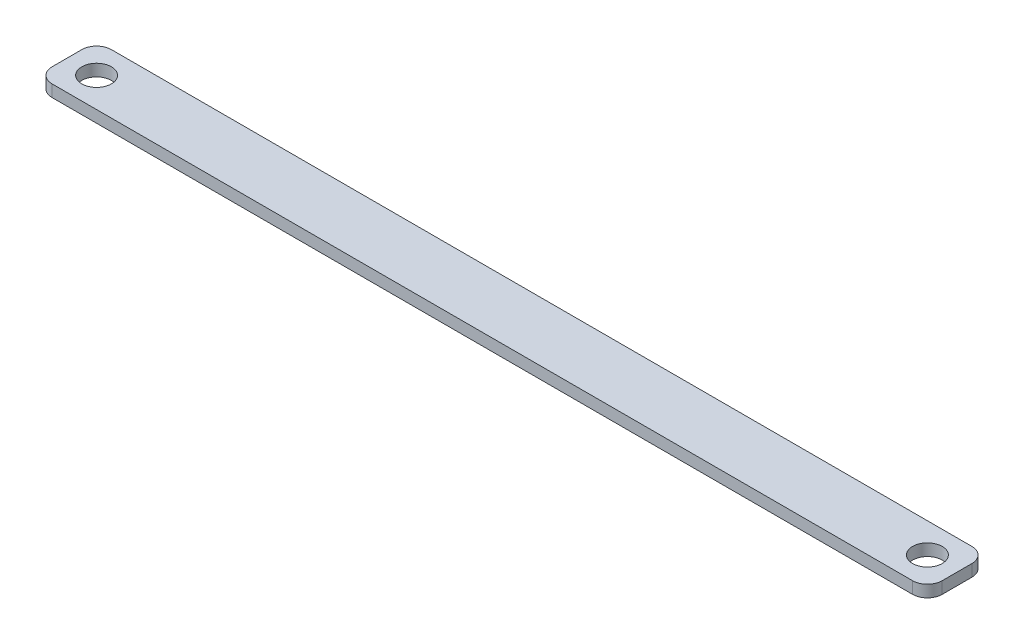
ISO-10303-21;
HEADER;
FILE_DESCRIPTION(('STEP AP214'),'2;1');
FILE_NAME('part.step','',(''),(''),'','','');
FILE_SCHEMA(('AUTOMOTIVE_DESIGN { 1 0 10303 214 1 1 1 1 }'));
ENDSEC;
DATA;
#1=APPLICATION_CONTEXT('core data for automotive mechanical design processes');
#2=APPLICATION_PROTOCOL_DEFINITION('international standard','automotive_design',2000,#1);
#3=PRODUCT_CONTEXT('',#1,'mechanical');
#4=PRODUCT('Part','Part','',(#3));
#5=PRODUCT_RELATED_PRODUCT_CATEGORY('part','',(#4));
#6=PRODUCT_DEFINITION_FORMATION('','',#4);
#7=PRODUCT_DEFINITION_CONTEXT('part definition',#1,'design');
#8=PRODUCT_DEFINITION('design','',#6,#7);
#9=PRODUCT_DEFINITION_SHAPE('','',#8);
#10=(LENGTH_UNIT() NAMED_UNIT(*) SI_UNIT(.MILLI.,.METRE.));
#11=(NAMED_UNIT(*) PLANE_ANGLE_UNIT() SI_UNIT($,.RADIAN.));
#12=(NAMED_UNIT(*) SI_UNIT($,.STERADIAN.) SOLID_ANGLE_UNIT());
#13=UNCERTAINTY_MEASURE_WITH_UNIT(LENGTH_MEASURE(1.E-05),#10,'distance_accuracy_value','');
#14=(GEOMETRIC_REPRESENTATION_CONTEXT(3) GLOBAL_UNCERTAINTY_ASSIGNED_CONTEXT((#13)) GLOBAL_UNIT_ASSIGNED_CONTEXT((#10,
#11,#12)) REPRESENTATION_CONTEXT('',''));
#15=CARTESIAN_POINT('',(0.,0.,0.));
#16=DIRECTION('',(0.,0.,1.));
#17=DIRECTION('',(1.,0.,0.));
#18=AXIS2_PLACEMENT_3D('',#15,#16,#17);
#19=CARTESIAN_POINT('',(96.2074893334134,2.,-5.));
#20=DIRECTION('',(0.,-1.,0.));
#21=DIRECTION('',(0.,0.,-1.));
#22=AXIS2_PLACEMENT_3D('',#19,#20,#21);
#23=CYLINDRICAL_SURFACE('',#22,2.5);
#24=CARTESIAN_POINT('',(96.2074893334134,0.,-5.));
#25=DIRECTION('',(0.,1.,0.));
#26=DIRECTION('',(0.,0.,1.));
#27=AXIS2_PLACEMENT_3D('',#24,#25,#26);
#28=CIRCLE('',#27,2.5);
#29=CARTESIAN_POINT('',(96.2074893334134,0.,-2.5));
#30=VERTEX_POINT('',#29);
#31=EDGE_CURVE('E220',#30,#30,#28,.T.);
#32=ORIENTED_EDGE('',*,*,#31,.F.);
#33=EDGE_LOOP('',(#32));
#34=FACE_BOUND('',#33,.T.);
#35=CARTESIAN_POINT('',(96.2074893334134,2.,-5.));
#36=DIRECTION('',(0.,1.,0.));
#37=DIRECTION('',(0.,0.,1.));
#38=AXIS2_PLACEMENT_3D('',#35,#36,#37);
#39=CIRCLE('',#38,2.5);
#40=CARTESIAN_POINT('',(96.2074893334134,2.,-2.5));
#41=VERTEX_POINT('',#40);
#42=EDGE_CURVE('E13',#41,#41,#39,.T.);
#43=ORIENTED_EDGE('',*,*,#42,.T.);
#44=EDGE_LOOP('',(#43));
#45=FACE_BOUND('',#44,.T.);
#46=ADVANCED_FACE('F93',(#34,#45),#23,.F.);
#47=CARTESIAN_POINT('',(-43.7925106665866,2.,-5.));
#48=DIRECTION('',(0.,-1.,0.));
#49=DIRECTION('',(0.,0.,-1.));
#50=AXIS2_PLACEMENT_3D('',#47,#48,#49);
#51=CYLINDRICAL_SURFACE('',#50,2.5);
#52=CARTESIAN_POINT('',(-43.7925106665866,0.,-5.));
#53=DIRECTION('',(0.,1.,0.));
#54=DIRECTION('',(0.,0.,1.));
#55=AXIS2_PLACEMENT_3D('',#52,#53,#54);
#56=CIRCLE('',#55,2.5);
#57=CARTESIAN_POINT('',(-43.7925106665866,0.,-2.5));
#58=VERTEX_POINT('',#57);
#59=EDGE_CURVE('E233',#58,#58,#56,.T.);
#60=ORIENTED_EDGE('',*,*,#59,.F.);
#61=EDGE_LOOP('',(#60));
#62=FACE_BOUND('',#61,.T.);
#63=CARTESIAN_POINT('',(-43.7925106665866,2.,-5.));
#64=DIRECTION('',(0.,1.,0.));
#65=DIRECTION('',(0.,0.,1.));
#66=AXIS2_PLACEMENT_3D('',#63,#64,#65);
#67=CIRCLE('',#66,2.5);
#68=CARTESIAN_POINT('',(-43.7925106665866,2.,-2.5));
#69=VERTEX_POINT('',#68);
#70=EDGE_CURVE('E103',#69,#69,#67,.T.);
#71=ORIENTED_EDGE('',*,*,#70,.T.);
#72=EDGE_LOOP('',(#71));
#73=FACE_BOUND('',#72,.T.);
#74=ADVANCED_FACE('F254',(#62,#73),#51,.F.);
#75=CARTESIAN_POINT('',(47.5,2.,-2.5));
#76=DIRECTION('',(0.,1.,0.));
#77=DIRECTION('',(0.,0.,1.));
#78=AXIS2_PLACEMENT_3D('',#75,#76,#77);
#79=PLANE('',#78);
#80=DIRECTION('',(1.,0.,0.));
#81=VECTOR('',#80,1.);
#82=CARTESIAN_POINT('',(-46.2925106665866,2.,0.));
#83=LINE('',#82,#81);
#84=CARTESIAN_POINT('',(-46.2925106665866,2.,0.));
#85=VERTEX_POINT('',#84);
#86=CARTESIAN_POINT('',(98.7074893334134,2.,0.));
#87=VERTEX_POINT('',#86);
#88=EDGE_CURVE('E156',#85,#87,#83,.T.);
#89=ORIENTED_EDGE('',*,*,#88,.T.);
#90=CARTESIAN_POINT('',(98.7074893334134,2.,-2.5));
#91=DIRECTION('',(0.,1.,0.));
#92=DIRECTION('',(0.,0.,1.));
#93=AXIS2_PLACEMENT_3D('',#90,#91,#92);
#94=CIRCLE('',#93,2.5);
#95=CARTESIAN_POINT('',(101.207489333413,2.,-2.50000000000002));
#96=VERTEX_POINT('',#95);
#97=EDGE_CURVE('E162',#87,#96,#94,.T.);
#98=ORIENTED_EDGE('',*,*,#97,.T.);
#99=DIRECTION('',(0.,0.,-1.));
#100=VECTOR('',#99,1.);
#101=CARTESIAN_POINT('',(101.207489333413,2.,-2.50000000000002));
#102=LINE('',#101,#100);
#103=CARTESIAN_POINT('',(101.207489333413,2.,-7.49999999999998));
#104=VERTEX_POINT('',#103);
#105=EDGE_CURVE('E184',#96,#104,#102,.T.);
#106=ORIENTED_EDGE('',*,*,#105,.T.);
#107=CARTESIAN_POINT('',(98.7074893334134,2.,-7.5));
#108=DIRECTION('',(0.,1.,0.));
#109=DIRECTION('',(0.,0.,-1.));
#110=AXIS2_PLACEMENT_3D('',#107,#108,#109);
#111=CIRCLE('',#110,2.5);
#112=CARTESIAN_POINT('',(98.7074893334134,2.,-10.));
#113=VERTEX_POINT('',#112);
#114=EDGE_CURVE('E188',#104,#113,#111,.T.);
#115=ORIENTED_EDGE('',*,*,#114,.T.);
#116=DIRECTION('',(-1.,0.,0.));
#117=VECTOR('',#116,1.);
#118=CARTESIAN_POINT('',(53.7074893334134,2.,-10.));
#119=LINE('',#118,#117);
#120=CARTESIAN_POINT('',(-46.2925106665866,2.,-10.));
#121=VERTEX_POINT('',#120);
#122=EDGE_CURVE('E242',#113,#121,#119,.T.);
#123=ORIENTED_EDGE('',*,*,#122,.T.);
#124=CARTESIAN_POINT('',(-46.2925106665866,2.,-7.5));
#125=DIRECTION('',(0.,1.,0.));
#126=DIRECTION('',(0.,0.,-1.));
#127=AXIS2_PLACEMENT_3D('',#124,#125,#126);
#128=CIRCLE('',#127,2.5);
#129=CARTESIAN_POINT('',(-48.7925106665866,2.,-7.49999999999998));
#130=VERTEX_POINT('',#129);
#131=EDGE_CURVE('E168',#121,#130,#128,.T.);
#132=ORIENTED_EDGE('',*,*,#131,.T.);
#133=DIRECTION('',(0.,0.,1.));
#134=VECTOR('',#133,1.);
#135=CARTESIAN_POINT('',(-48.7925106665866,2.,-2.50000000000002));
#136=LINE('',#135,#134);
#137=CARTESIAN_POINT('',(-48.7925106665866,2.,-2.50000000000002));
#138=VERTEX_POINT('',#137);
#139=EDGE_CURVE('E186',#130,#138,#136,.T.);
#140=ORIENTED_EDGE('',*,*,#139,.T.);
#141=CARTESIAN_POINT('',(-46.2925106665866,2.,-2.5));
#142=DIRECTION('',(0.,1.,0.));
#143=DIRECTION('',(0.,0.,-1.));
#144=AXIS2_PLACEMENT_3D('',#141,#142,#143);
#145=CIRCLE('',#144,2.5);
#146=EDGE_CURVE('E165',#138,#85,#145,.T.);
#147=ORIENTED_EDGE('',*,*,#146,.T.);
#148=EDGE_LOOP('',(#89,#98,#106,#115,#123,#132,#140,#147));
#149=FACE_BOUND('',#148,.T.);
#150=ORIENTED_EDGE('',*,*,#42,.F.);
#151=EDGE_LOOP('',(#150));
#152=FACE_BOUND('',#151,.T.);
#153=ORIENTED_EDGE('',*,*,#70,.F.);
#154=EDGE_LOOP('',(#153));
#155=FACE_BOUND('',#154,.T.);
#156=ADVANCED_FACE('F158',(#149,#152,#155),#79,.T.);
#157=CARTESIAN_POINT('',(98.7074893334134,0.,-2.5));
#158=DIRECTION('',(0.,1.,0.));
#159=DIRECTION('',(0.,0.,1.));
#160=AXIS2_PLACEMENT_3D('',#157,#158,#159);
#161=PLANE('',#160);
#162=ORIENTED_EDGE('',*,*,#31,.T.);
#163=EDGE_LOOP('',(#162));
#164=FACE_BOUND('',#163,.T.);
#165=CARTESIAN_POINT('',(98.7074893334134,0.,-2.5));
#166=DIRECTION('',(0.,1.,0.));
#167=DIRECTION('',(0.,0.,1.));
#168=AXIS2_PLACEMENT_3D('',#165,#166,#167);
#169=CIRCLE('',#168,2.5);
#170=CARTESIAN_POINT('',(98.7074893334134,0.,0.));
#171=VERTEX_POINT('',#170);
#172=CARTESIAN_POINT('',(101.207489333413,0.,-2.50000000000002));
#173=VERTEX_POINT('',#172);
#174=EDGE_CURVE('E177',#171,#173,#169,.T.);
#175=ORIENTED_EDGE('',*,*,#174,.F.);
#176=DIRECTION('',(1.,0.,0.));
#177=VECTOR('',#176,1.);
#178=CARTESIAN_POINT('',(-46.2925106665866,0.,0.));
#179=LINE('',#178,#177);
#180=CARTESIAN_POINT('',(-46.2925106665866,0.,0.));
#181=VERTEX_POINT('',#180);
#182=EDGE_CURVE('E173',#181,#171,#179,.T.);
#183=ORIENTED_EDGE('',*,*,#182,.F.);
#184=CARTESIAN_POINT('',(-46.2925106665866,0.,-2.5));
#185=DIRECTION('',(0.,1.,0.));
#186=DIRECTION('',(0.,0.,-1.));
#187=AXIS2_PLACEMENT_3D('',#184,#185,#186);
#188=CIRCLE('',#187,2.5);
#189=CARTESIAN_POINT('',(-48.7925106665866,0.,-2.50000000000002));
#190=VERTEX_POINT('',#189);
#191=EDGE_CURVE('E199',#190,#181,#188,.T.);
#192=ORIENTED_EDGE('',*,*,#191,.F.);
#193=DIRECTION('',(0.,0.,1.));
#194=VECTOR('',#193,1.);
#195=CARTESIAN_POINT('',(-48.7925106665866,0.,-2.50000000000002));
#196=LINE('',#195,#194);
#197=CARTESIAN_POINT('',(-48.7925106665866,0.,-7.49999999999998));
#198=VERTEX_POINT('',#197);
#199=EDGE_CURVE('E206',#198,#190,#196,.T.);
#200=ORIENTED_EDGE('',*,*,#199,.F.);
#201=CARTESIAN_POINT('',(-46.2925106665866,0.,-7.5));
#202=DIRECTION('',(0.,1.,0.));
#203=DIRECTION('',(0.,0.,-1.));
#204=AXIS2_PLACEMENT_3D('',#201,#202,#203);
#205=CIRCLE('',#204,2.5);
#206=CARTESIAN_POINT('',(-46.2925106665866,0.,-10.));
#207=VERTEX_POINT('',#206);
#208=EDGE_CURVE('E212',#207,#198,#205,.T.);
#209=ORIENTED_EDGE('',*,*,#208,.F.);
#210=DIRECTION('',(-1.,0.,0.));
#211=VECTOR('',#210,1.);
#212=CARTESIAN_POINT('',(53.7074893334134,0.,-10.));
#213=LINE('',#212,#211);
#214=CARTESIAN_POINT('',(98.7074893334134,0.,-10.));
#215=VERTEX_POINT('',#214);
#216=EDGE_CURVE('E218',#215,#207,#213,.T.);
#217=ORIENTED_EDGE('',*,*,#216,.F.);
#218=CARTESIAN_POINT('',(98.7074893334134,0.,-7.5));
#219=DIRECTION('',(0.,1.,0.));
#220=DIRECTION('',(0.,0.,-1.));
#221=AXIS2_PLACEMENT_3D('',#218,#219,#220);
#222=CIRCLE('',#221,2.5);
#223=CARTESIAN_POINT('',(101.207489333413,0.,-7.49999999999998));
#224=VERTEX_POINT('',#223);
#225=EDGE_CURVE('E223',#224,#215,#222,.T.);
#226=ORIENTED_EDGE('',*,*,#225,.F.);
#227=DIRECTION('',(0.,0.,-1.));
#228=VECTOR('',#227,1.);
#229=CARTESIAN_POINT('',(101.207489333413,0.,-2.50000000000002));
#230=LINE('',#229,#228);
#231=EDGE_CURVE('E178',#173,#224,#230,.T.);
#232=ORIENTED_EDGE('',*,*,#231,.F.);
#233=EDGE_LOOP('',(#175,#183,#192,#200,#209,#217,#226,#232));
#234=FACE_BOUND('',#233,.T.);
#235=ORIENTED_EDGE('',*,*,#59,.T.);
#236=EDGE_LOOP('',(#235));
#237=FACE_BOUND('',#236,.T.);
#238=ADVANCED_FACE('F249',(#164,#234,#237),#161,.F.);
#239=CARTESIAN_POINT('',(53.7074893334134,2.,-10.));
#240=DIRECTION('',(0.,0.,1.));
#241=DIRECTION('',(1.,0.,0.));
#242=AXIS2_PLACEMENT_3D('',#239,#240,#241);
#243=PLANE('',#242);
#244=ORIENTED_EDGE('',*,*,#216,.T.);
#245=DIRECTION('',(0.,-1.,0.));
#246=VECTOR('',#245,1.);
#247=CARTESIAN_POINT('',(-46.2925106665866,2.,-10.));
#248=LINE('',#247,#246);
#249=EDGE_CURVE('E209',#121,#207,#248,.T.);
#250=ORIENTED_EDGE('',*,*,#249,.F.);
#251=ORIENTED_EDGE('',*,*,#122,.F.);
#252=DIRECTION('',(0.,-1.,0.));
#253=VECTOR('',#252,1.);
#254=CARTESIAN_POINT('',(98.7074893334134,2.,-10.));
#255=LINE('',#254,#253);
#256=EDGE_CURVE('E112',#113,#215,#255,.T.);
#257=ORIENTED_EDGE('',*,*,#256,.T.);
#258=EDGE_LOOP('',(#244,#250,#251,#257));
#259=FACE_BOUND('',#258,.T.);
#260=ADVANCED_FACE('F271',(#259),#243,.F.);
#261=CARTESIAN_POINT('',(53.7074893334134,2.,0.));
#262=DIRECTION('',(0.,0.,-1.));
#263=DIRECTION('',(-1.,0.,0.));
#264=AXIS2_PLACEMENT_3D('',#261,#262,#263);
#265=PLANE('',#264);
#266=DIRECTION('',(0.,-1.,0.));
#267=VECTOR('',#266,1.);
#268=CARTESIAN_POINT('',(98.7074893334134,2.,0.));
#269=LINE('',#268,#267);
#270=EDGE_CURVE('E171',#87,#171,#269,.T.);
#271=ORIENTED_EDGE('',*,*,#270,.F.);
#272=ORIENTED_EDGE('',*,*,#88,.F.);
#273=DIRECTION('',(0.,-1.,0.));
#274=VECTOR('',#273,1.);
#275=CARTESIAN_POINT('',(-46.2925106665866,2.,0.));
#276=LINE('',#275,#274);
#277=EDGE_CURVE('E196',#85,#181,#276,.T.);
#278=ORIENTED_EDGE('',*,*,#277,.T.);
#279=ORIENTED_EDGE('',*,*,#182,.T.);
#280=EDGE_LOOP('',(#271,#272,#278,#279));
#281=FACE_BOUND('',#280,.T.);
#282=ADVANCED_FACE('F172',(#281),#265,.F.);
#283=CARTESIAN_POINT('',(98.7074893334134,2.,-2.5));
#284=DIRECTION('',(0.,-1.,0.));
#285=DIRECTION('',(0.,0.,-1.));
#286=AXIS2_PLACEMENT_3D('',#283,#284,#285);
#287=CYLINDRICAL_SURFACE('',#286,2.5);
#288=ORIENTED_EDGE('',*,*,#174,.T.);
#289=DIRECTION('',(0.,-1.,0.));
#290=VECTOR('',#289,1.);
#291=CARTESIAN_POINT('',(101.207489333413,2.,-2.50000000000002));
#292=LINE('',#291,#290);
#293=EDGE_CURVE('E182',#96,#173,#292,.T.);
#294=ORIENTED_EDGE('',*,*,#293,.F.);
#295=ORIENTED_EDGE('',*,*,#97,.F.);
#296=ORIENTED_EDGE('',*,*,#270,.T.);
#297=EDGE_LOOP('',(#288,#294,#295,#296));
#298=FACE_BOUND('',#297,.T.);
#299=ADVANCED_FACE('F180',(#298),#287,.T.);
#300=CARTESIAN_POINT('',(101.207489333413,2.,-2.50000000000002));
#301=DIRECTION('',(-1.,0.,0.));
#302=DIRECTION('',(0.,0.,1.));
#303=AXIS2_PLACEMENT_3D('',#300,#301,#302);
#304=PLANE('',#303);
#305=ORIENTED_EDGE('',*,*,#231,.T.);
#306=DIRECTION('',(0.,-1.,0.));
#307=VECTOR('',#306,1.);
#308=CARTESIAN_POINT('',(101.207489333413,2.,-7.49999999999998));
#309=LINE('',#308,#307);
#310=EDGE_CURVE('E215',#104,#224,#309,.T.);
#311=ORIENTED_EDGE('',*,*,#310,.F.);
#312=ORIENTED_EDGE('',*,*,#105,.F.);
#313=ORIENTED_EDGE('',*,*,#293,.T.);
#314=EDGE_LOOP('',(#305,#311,#312,#313));
#315=FACE_BOUND('',#314,.T.);
#316=ADVANCED_FACE('F278',(#315),#304,.F.);
#317=CARTESIAN_POINT('',(98.7074893334134,2.,-7.5));
#318=DIRECTION('',(0.,-1.,0.));
#319=DIRECTION('',(0.,0.,-1.));
#320=AXIS2_PLACEMENT_3D('',#317,#318,#319);
#321=CYLINDRICAL_SURFACE('',#320,2.5);
#322=ORIENTED_EDGE('',*,*,#225,.T.);
#323=ORIENTED_EDGE('',*,*,#256,.F.);
#324=ORIENTED_EDGE('',*,*,#114,.F.);
#325=ORIENTED_EDGE('',*,*,#310,.T.);
#326=EDGE_LOOP('',(#322,#323,#324,#325));
#327=FACE_BOUND('',#326,.T.);
#328=ADVANCED_FACE('F281',(#327),#321,.T.);
#329=CARTESIAN_POINT('',(-46.2925106665866,2.,-7.5));
#330=DIRECTION('',(0.,-1.,0.));
#331=DIRECTION('',(0.,0.,-1.));
#332=AXIS2_PLACEMENT_3D('',#329,#330,#331);
#333=CYLINDRICAL_SURFACE('',#332,2.5);
#334=ORIENTED_EDGE('',*,*,#208,.T.);
#335=DIRECTION('',(0.,-1.,0.));
#336=VECTOR('',#335,1.);
#337=CARTESIAN_POINT('',(-48.7925106665866,2.,-7.49999999999998));
#338=LINE('',#337,#336);
#339=EDGE_CURVE('E202',#130,#198,#338,.T.);
#340=ORIENTED_EDGE('',*,*,#339,.F.);
#341=ORIENTED_EDGE('',*,*,#131,.F.);
#342=ORIENTED_EDGE('',*,*,#249,.T.);
#343=EDGE_LOOP('',(#334,#340,#341,#342));
#344=FACE_BOUND('',#343,.T.);
#345=ADVANCED_FACE('F285',(#344),#333,.T.);
#346=CARTESIAN_POINT('',(-48.7925106665866,2.,-2.50000000000002));
#347=DIRECTION('',(1.,0.,0.));
#348=DIRECTION('',(0.,0.,-1.));
#349=AXIS2_PLACEMENT_3D('',#346,#347,#348);
#350=PLANE('',#349);
#351=ORIENTED_EDGE('',*,*,#199,.T.);
#352=DIRECTION('',(0.,-1.,0.));
#353=VECTOR('',#352,1.);
#354=CARTESIAN_POINT('',(-48.7925106665866,2.,-2.50000000000002));
#355=LINE('',#354,#353);
#356=EDGE_CURVE('E203',#138,#190,#355,.T.);
#357=ORIENTED_EDGE('',*,*,#356,.F.);
#358=ORIENTED_EDGE('',*,*,#139,.F.);
#359=ORIENTED_EDGE('',*,*,#339,.T.);
#360=EDGE_LOOP('',(#351,#357,#358,#359));
#361=FACE_BOUND('',#360,.T.);
#362=ADVANCED_FACE('F288',(#361),#350,.F.);
#363=CARTESIAN_POINT('',(-46.2925106665866,2.,-2.5));
#364=DIRECTION('',(0.,-1.,0.));
#365=DIRECTION('',(0.,0.,-1.));
#366=AXIS2_PLACEMENT_3D('',#363,#364,#365);
#367=CYLINDRICAL_SURFACE('',#366,2.5);
#368=ORIENTED_EDGE('',*,*,#191,.T.);
#369=ORIENTED_EDGE('',*,*,#277,.F.);
#370=ORIENTED_EDGE('',*,*,#146,.F.);
#371=ORIENTED_EDGE('',*,*,#356,.T.);
#372=EDGE_LOOP('',(#368,#369,#370,#371));
#373=FACE_BOUND('',#372,.T.);
#374=ADVANCED_FACE('F95',(#373),#367,.T.);
#375=CLOSED_SHELL('',(#46,#74,#156,#238,#260,#282,#299,#316,#328,#345,#362,#374));
#376=MANIFOLD_SOLID_BREP('B2',#375);
#377=ADVANCED_BREP_SHAPE_REPRESENTATION('',(#18,#376),#14);
#378=SHAPE_DEFINITION_REPRESENTATION(#9,#377);
ENDSEC;
END-ISO-10303-21;
